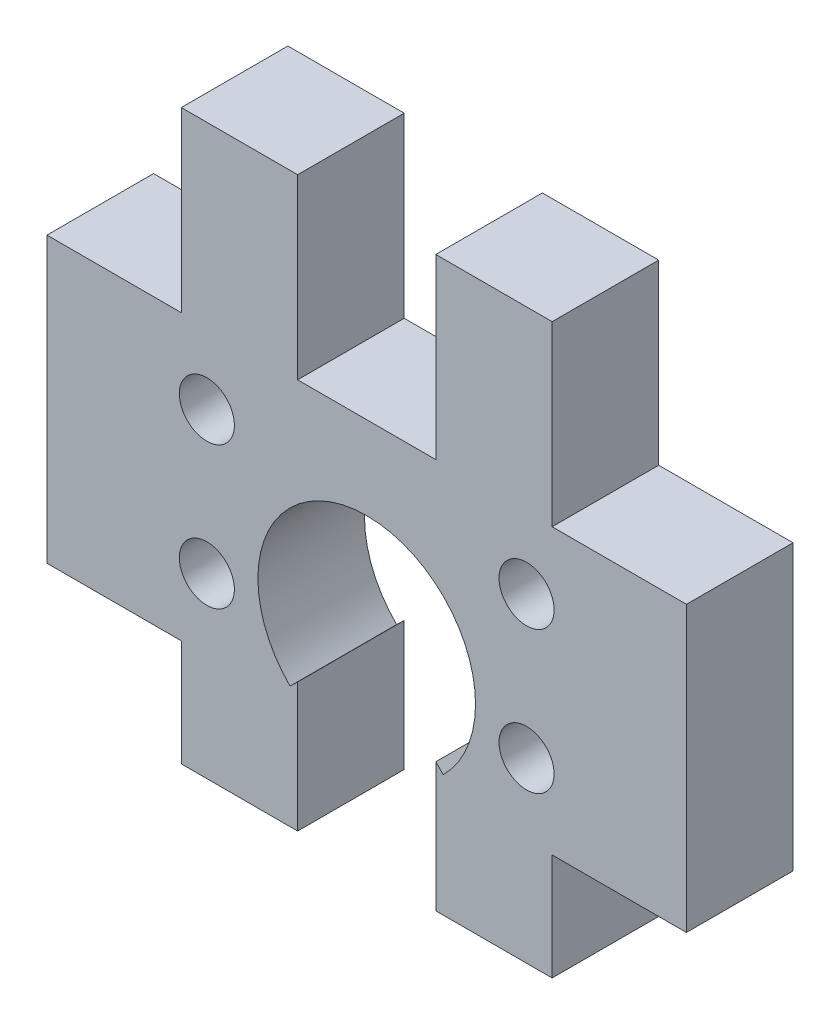
ISO-10303-21;
HEADER;
FILE_DESCRIPTION(('STEP AP214'),'2;1');
FILE_NAME('part.step','',(''),(''),'','','');
FILE_SCHEMA(('AUTOMOTIVE_DESIGN { 1 0 10303 214 1 1 1 1 }'));
ENDSEC;
DATA;
#1=APPLICATION_CONTEXT('core data for automotive mechanical design processes');
#2=APPLICATION_PROTOCOL_DEFINITION('international standard','automotive_design',2000,#1);
#3=PRODUCT_CONTEXT('',#1,'mechanical');
#4=PRODUCT('Part','Part','',(#3));
#5=PRODUCT_RELATED_PRODUCT_CATEGORY('part','',(#4));
#6=PRODUCT_DEFINITION_FORMATION('','',#4);
#7=PRODUCT_DEFINITION_CONTEXT('part definition',#1,'design');
#8=PRODUCT_DEFINITION('design','',#6,#7);
#9=PRODUCT_DEFINITION_SHAPE('','',#8);
#10=(LENGTH_UNIT() NAMED_UNIT(*) SI_UNIT(.MILLI.,.METRE.));
#11=(NAMED_UNIT(*) PLANE_ANGLE_UNIT() SI_UNIT($,.RADIAN.));
#12=(NAMED_UNIT(*) SI_UNIT($,.STERADIAN.) SOLID_ANGLE_UNIT());
#13=UNCERTAINTY_MEASURE_WITH_UNIT(LENGTH_MEASURE(1.E-05),#10,'distance_accuracy_value','');
#14=(GEOMETRIC_REPRESENTATION_CONTEXT(3) GLOBAL_UNCERTAINTY_ASSIGNED_CONTEXT((#13)) GLOBAL_UNIT_ASSIGNED_CONTEXT((#10,
#11,#12)) REPRESENTATION_CONTEXT('',''));
#15=CARTESIAN_POINT('',(0.,0.,0.));
#16=DIRECTION('',(0.,0.,1.));
#17=DIRECTION('',(1.,0.,0.));
#18=AXIS2_PLACEMENT_3D('',#15,#16,#17);
#19=CARTESIAN_POINT('',(49.6145376154278,-22.,-64.0000000008047));
#20=DIRECTION('',(-1.,0.,0.));
#21=DIRECTION('',(0.,0.,1.));
#22=AXIS2_PLACEMENT_3D('',#19,#20,#21);
#23=PLANE('',#22);
#24=DIRECTION('',(0.,1.,0.));
#25=VECTOR('',#24,1.);
#26=CARTESIAN_POINT('',(49.6145376154278,-22.,-70.0000000008047));
#27=LINE('',#26,#25);
#28=CARTESIAN_POINT('',(49.6145376154278,-22.,-70.0000000008047));
#29=VERTEX_POINT('',#28);
#30=CARTESIAN_POINT('',(49.6145376154278,-14.7305411481388,-70.0000000008047));
#31=VERTEX_POINT('',#30);
#32=EDGE_CURVE('E321',#29,#31,#27,.T.);
#33=ORIENTED_EDGE('',*,*,#32,.T.);
#34=DIRECTION('',(0.,0.,-1.));
#35=VECTOR('',#34,1.);
#36=CARTESIAN_POINT('',(49.6145376154278,-14.7305411481388,-64.0000000008047));
#37=LINE('',#36,#35);
#38=CARTESIAN_POINT('',(49.6145376154278,-14.7305411481388,-64.0000000008047));
#39=VERTEX_POINT('',#38);
#40=EDGE_CURVE('E333',#39,#31,#37,.T.);
#41=ORIENTED_EDGE('',*,*,#40,.F.);
#42=DIRECTION('',(0.,1.,0.));
#43=VECTOR('',#42,1.);
#44=CARTESIAN_POINT('',(49.6145376154278,-22.,-64.0000000008047));
#45=LINE('',#44,#43);
#46=CARTESIAN_POINT('',(49.6145376154278,-22.,-64.0000000008047));
#47=VERTEX_POINT('',#46);
#48=EDGE_CURVE('E11',#47,#39,#45,.T.);
#49=ORIENTED_EDGE('',*,*,#48,.F.);
#50=DIRECTION('',(0.,0.,1.));
#51=VECTOR('',#50,1.);
#52=CARTESIAN_POINT('',(49.6145376154278,-22.,-64.0000000008047));
#53=LINE('',#52,#51);
#54=EDGE_CURVE('E315',#29,#47,#53,.T.);
#55=ORIENTED_EDGE('',*,*,#54,.F.);
#56=EDGE_LOOP('',(#33,#41,#49,#55));
#57=FACE_BOUND('',#56,.T.);
#58=ADVANCED_FACE('F36',(#57),#23,.F.);
#59=CARTESIAN_POINT('',(49.6145376154278,-22.,-64.0000000008047));
#60=DIRECTION('',(0.,0.,-1.));
#61=DIRECTION('',(-1.,0.,0.));
#62=AXIS2_PLACEMENT_3D('',#59,#60,#61);
#63=PLANE('',#62);
#64=ORIENTED_EDGE('',*,*,#48,.T.);
#65=DIRECTION('',(0.717506685731035,0.696551617564172,0.));
#66=VECTOR('',#65,1.);
#67=CARTESIAN_POINT('',(49.6145376154278,-14.7305411481388,-64.0000000008047));
#68=LINE('',#67,#66);
#69=CARTESIAN_POINT('',(49.1867802462308,-15.1458056932149,-64.0000000008047));
#70=VERTEX_POINT('',#69);
#71=EDGE_CURVE('E339',#70,#39,#68,.T.);
#72=ORIENTED_EDGE('',*,*,#71,.F.);
#73=CARTESIAN_POINT('',(53.5029820344726,-10.8,-64.0000000008047));
#74=DIRECTION('',(0.,0.,1.));
#75=DIRECTION('',(-1.,0.,0.));
#76=AXIS2_PLACEMENT_3D('',#73,#74,#75);
#77=CIRCLE('',#76,6.125);
#78=CARTESIAN_POINT('',(57.8128248740396,-15.1521120962393,-64.0000000008047));
#79=VERTEX_POINT('',#78);
#80=EDGE_CURVE('E344',#79,#70,#77,.T.);
#81=ORIENTED_EDGE('',*,*,#80,.F.);
#82=DIRECTION('',(0.706962045319872,-0.707251487433673,0.));
#83=VECTOR('',#82,1.);
#84=CARTESIAN_POINT('',(57.3914264535173,-14.7305411481388,-64.0000000008047));
#85=LINE('',#84,#83);
#86=CARTESIAN_POINT('',(57.3914264535173,-14.7305411481388,-64.0000000008047));
#87=VERTEX_POINT('',#86);
#88=EDGE_CURVE('E346',#87,#79,#85,.T.);
#89=ORIENTED_EDGE('',*,*,#88,.F.);
#90=DIRECTION('',(0.,1.,0.));
#91=VECTOR('',#90,1.);
#92=CARTESIAN_POINT('',(57.3914264535173,-16.,-64.0000000008047));
#93=LINE('',#92,#91);
#94=CARTESIAN_POINT('',(57.3914264535173,-22.,-64.0000000008047));
#95=VERTEX_POINT('',#94);
#96=EDGE_CURVE('E361',#95,#87,#93,.T.);
#97=ORIENTED_EDGE('',*,*,#96,.F.);
#98=DIRECTION('',(-1.,0.,0.));
#99=VECTOR('',#98,1.);
#100=CARTESIAN_POINT('',(57.3914264535173,-22.,-64.0000000008047));
#101=LINE('',#100,#99);
#102=CARTESIAN_POINT('',(63.9414264535173,-22.,-64.0000000008047));
#103=VERTEX_POINT('',#102);
#104=EDGE_CURVE('E735',#103,#95,#101,.T.);
#105=ORIENTED_EDGE('',*,*,#104,.F.);
#106=DIRECTION('',(0.,1.,0.));
#107=VECTOR('',#106,1.);
#108=CARTESIAN_POINT('',(63.9414264535173,-22.,-64.0000000008047));
#109=LINE('',#108,#107);
#110=CARTESIAN_POINT('',(63.9414264535173,-16.,-64.0000000008047));
#111=VERTEX_POINT('',#110);
#112=EDGE_CURVE('E741',#103,#111,#109,.T.);
#113=ORIENTED_EDGE('',*,*,#112,.T.);
#114=DIRECTION('',(1.,0.,0.));
#115=VECTOR('',#114,1.);
#116=CARTESIAN_POINT('',(71.5029820344726,-16.,-64.0000000008047));
#117=LINE('',#116,#115);
#118=CARTESIAN_POINT('',(71.5029820344726,-16.,-64.0000000008047));
#119=VERTEX_POINT('',#118);
#120=EDGE_CURVE('E293',#111,#119,#117,.T.);
#121=ORIENTED_EDGE('',*,*,#120,.T.);
#122=DIRECTION('',(0.,1.,0.));
#123=VECTOR('',#122,1.);
#124=CARTESIAN_POINT('',(71.5029820344726,0.,-64.0000000008047));
#125=LINE('',#124,#123);
#126=CARTESIAN_POINT('',(71.5029820344726,0.,-64.0000000008047));
#127=VERTEX_POINT('',#126);
#128=EDGE_CURVE('E264',#119,#127,#125,.T.);
#129=ORIENTED_EDGE('',*,*,#128,.T.);
#130=DIRECTION('',(-1.,0.,0.));
#131=VECTOR('',#130,1.);
#132=CARTESIAN_POINT('',(71.5029820344726,0.,-64.0000000008047));
#133=LINE('',#132,#131);
#134=CARTESIAN_POINT('',(63.9414264535173,0.,-64.0000000008047));
#135=VERTEX_POINT('',#134);
#136=EDGE_CURVE('E276',#127,#135,#133,.T.);
#137=ORIENTED_EDGE('',*,*,#136,.T.);
#138=DIRECTION('',(0.,-1.,0.));
#139=VECTOR('',#138,1.);
#140=CARTESIAN_POINT('',(63.9414264535173,10.,-64.0000000008047));
#141=LINE('',#140,#139);
#142=CARTESIAN_POINT('',(63.9414264535173,10.,-64.0000000008047));
#143=VERTEX_POINT('',#142);
#144=EDGE_CURVE('E241',#143,#135,#141,.T.);
#145=ORIENTED_EDGE('',*,*,#144,.F.);
#146=DIRECTION('',(1.,0.,0.));
#147=VECTOR('',#146,1.);
#148=CARTESIAN_POINT('',(63.9414264535173,10.,-64.0000000008047));
#149=LINE('',#148,#147);
#150=CARTESIAN_POINT('',(57.3914264535173,10.,-64.0000000008047));
#151=VERTEX_POINT('',#150);
#152=EDGE_CURVE('E219',#151,#143,#149,.T.);
#153=ORIENTED_EDGE('',*,*,#152,.F.);
#154=DIRECTION('',(0.,-1.,0.));
#155=VECTOR('',#154,1.);
#156=CARTESIAN_POINT('',(57.3914264535173,10.,-64.0000000008047));
#157=LINE('',#156,#155);
#158=CARTESIAN_POINT('',(57.3914264535173,0.,-64.0000000008047));
#159=VERTEX_POINT('',#158);
#160=EDGE_CURVE('E228',#151,#159,#157,.T.);
#161=ORIENTED_EDGE('',*,*,#160,.T.);
#162=CARTESIAN_POINT('',(49.6145376154278,0.,-64.0000000008047));
#163=VERTEX_POINT('',#162);
#164=EDGE_CURVE('E263',#159,#163,#133,.T.);
#165=ORIENTED_EDGE('',*,*,#164,.T.);
#166=DIRECTION('',(0.,-1.,0.));
#167=VECTOR('',#166,1.);
#168=CARTESIAN_POINT('',(49.6145376154278,10.,-64.0000000008047));
#169=LINE('',#168,#167);
#170=CARTESIAN_POINT('',(49.6145376154278,10.,-64.0000000008047));
#171=VERTEX_POINT('',#170);
#172=EDGE_CURVE('E215',#171,#163,#169,.T.);
#173=ORIENTED_EDGE('',*,*,#172,.F.);
#174=DIRECTION('',(1.,0.,0.));
#175=VECTOR('',#174,1.);
#176=CARTESIAN_POINT('',(49.6145376154278,10.,-64.0000000008047));
#177=LINE('',#176,#175);
#178=CARTESIAN_POINT('',(43.0645376154278,10.,-64.0000000008047));
#179=VERTEX_POINT('',#178);
#180=EDGE_CURVE('E192',#179,#171,#177,.T.);
#181=ORIENTED_EDGE('',*,*,#180,.F.);
#182=DIRECTION('',(0.,-1.,0.));
#183=VECTOR('',#182,1.);
#184=CARTESIAN_POINT('',(43.0645376154278,10.,-64.0000000008047));
#185=LINE('',#184,#183);
#186=CARTESIAN_POINT('',(43.0645376154278,0.,-64.0000000008047));
#187=VERTEX_POINT('',#186);
#188=EDGE_CURVE('E189',#179,#187,#185,.T.);
#189=ORIENTED_EDGE('',*,*,#188,.T.);
#190=CARTESIAN_POINT('',(35.5029820344726,0.,-64.0000000008047));
#191=VERTEX_POINT('',#190);
#192=EDGE_CURVE('E260',#187,#191,#133,.T.);
#193=ORIENTED_EDGE('',*,*,#192,.T.);
#194=DIRECTION('',(0.,-1.,0.));
#195=VECTOR('',#194,1.);
#196=CARTESIAN_POINT('',(35.5029820344726,0.,-64.0000000008047));
#197=LINE('',#196,#195);
#198=CARTESIAN_POINT('',(35.5029820344726,-16.,-64.0000000008047));
#199=VERTEX_POINT('',#198);
#200=EDGE_CURVE('E270',#191,#199,#197,.T.);
#201=ORIENTED_EDGE('',*,*,#200,.T.);
#202=CARTESIAN_POINT('',(43.0645376154278,-16.,-64.0000000008047));
#203=VERTEX_POINT('',#202);
#204=EDGE_CURVE('E290',#199,#203,#117,.T.);
#205=ORIENTED_EDGE('',*,*,#204,.T.);
#206=DIRECTION('',(0.,1.,0.));
#207=VECTOR('',#206,1.);
#208=CARTESIAN_POINT('',(43.0645376154278,-22.,-64.0000000008047));
#209=LINE('',#208,#207);
#210=CARTESIAN_POINT('',(43.0645376154278,-22.,-64.0000000008047));
#211=VERTEX_POINT('',#210);
#212=EDGE_CURVE('E43',#211,#203,#209,.T.);
#213=ORIENTED_EDGE('',*,*,#212,.F.);
#214=DIRECTION('',(-1.,0.,0.));
#215=VECTOR('',#214,1.);
#216=CARTESIAN_POINT('',(49.6145376154278,-22.,-64.0000000008047));
#217=LINE('',#216,#215);
#218=EDGE_CURVE('E317',#47,#211,#217,.T.);
#219=ORIENTED_EDGE('',*,*,#218,.F.);
#220=EDGE_LOOP('',(#64,#72,#81,#89,#97,#105,#113,#121,#129,#137,#145,#153,#161,#165,#173,#181,
#189,#193,#201,#205,#213,#219));
#221=FACE_BOUND('',#220,.T.);
#222=CARTESIAN_POINT('',(62.5029820344725,-12.,-64.0000000008047));
#223=DIRECTION('',(0.,0.,-1.));
#224=DIRECTION('',(-1.,0.,0.));
#225=AXIS2_PLACEMENT_3D('',#222,#223,#224);
#226=CIRCLE('',#225,1.54999999999999);
#227=CARTESIAN_POINT('',(60.9529820344726,-12.,-64.0000000008047));
#228=VERTEX_POINT('',#227);
#229=EDGE_CURVE('E747',#228,#228,#226,.T.);
#230=ORIENTED_EDGE('',*,*,#229,.T.);
#231=EDGE_LOOP('',(#230));
#232=FACE_BOUND('',#231,.T.);
#233=CARTESIAN_POINT('',(44.5029820344726,-12.,-64.0000000008047));
#234=DIRECTION('',(0.,0.,-1.));
#235=DIRECTION('',(-1.,0.,0.));
#236=AXIS2_PLACEMENT_3D('',#233,#234,#235);
#237=CIRCLE('',#236,1.55);
#238=CARTESIAN_POINT('',(42.9529820344725,-12.,-64.0000000008047));
#239=VERTEX_POINT('',#238);
#240=EDGE_CURVE('E753',#239,#239,#237,.T.);
#241=ORIENTED_EDGE('',*,*,#240,.T.);
#242=EDGE_LOOP('',(#241));
#243=FACE_BOUND('',#242,.T.);
#244=CARTESIAN_POINT('',(44.5029820344726,-4.,-64.0000000008047));
#245=DIRECTION('',(0.,0.,-1.));
#246=DIRECTION('',(-1.,0.,0.));
#247=AXIS2_PLACEMENT_3D('',#244,#245,#246);
#248=CIRCLE('',#247,1.55);
#249=CARTESIAN_POINT('',(42.9529820344725,-4.,-64.0000000008047));
#250=VERTEX_POINT('',#249);
#251=EDGE_CURVE('E759',#250,#250,#248,.T.);
#252=ORIENTED_EDGE('',*,*,#251,.T.);
#253=EDGE_LOOP('',(#252));
#254=FACE_BOUND('',#253,.T.);
#255=CARTESIAN_POINT('',(62.5029820344725,-4.,-64.0000000008047));
#256=DIRECTION('',(0.,0.,-1.));
#257=DIRECTION('',(-1.,0.,0.));
#258=AXIS2_PLACEMENT_3D('',#255,#256,#257);
#259=CIRCLE('',#258,1.54999999999999);
#260=CARTESIAN_POINT('',(60.9529820344726,-4.,-64.0000000008047));
#261=VERTEX_POINT('',#260);
#262=EDGE_CURVE('E354',#261,#261,#259,.T.);
#263=ORIENTED_EDGE('',*,*,#262,.T.);
#264=EDGE_LOOP('',(#263));
#265=FACE_BOUND('',#264,.T.);
#266=ADVANCED_FACE('F304',(#221,#232,#243,#254,#265),#63,.F.);
#267=CARTESIAN_POINT('',(43.0645376154278,-22.,-64.0000000008047));
#268=DIRECTION('',(1.,0.,0.));
#269=DIRECTION('',(0.,0.,-1.));
#270=AXIS2_PLACEMENT_3D('',#267,#268,#269);
#271=PLANE('',#270);
#272=DIRECTION('',(0.,0.,-1.));
#273=VECTOR('',#272,1.);
#274=CARTESIAN_POINT('',(43.0645376154278,-16.,-64.0000000008047));
#275=LINE('',#274,#273);
#276=CARTESIAN_POINT('',(43.0645376154278,-16.,-70.0000000008047));
#277=VERTEX_POINT('',#276);
#278=EDGE_CURVE('E289',#203,#277,#275,.T.);
#279=ORIENTED_EDGE('',*,*,#278,.T.);
#280=DIRECTION('',(0.,1.,0.));
#281=VECTOR('',#280,1.);
#282=CARTESIAN_POINT('',(43.0645376154278,-22.,-70.0000000008047));
#283=LINE('',#282,#281);
#284=CARTESIAN_POINT('',(43.0645376154278,-22.,-70.0000000008047));
#285=VERTEX_POINT('',#284);
#286=EDGE_CURVE('E323',#285,#277,#283,.T.);
#287=ORIENTED_EDGE('',*,*,#286,.F.);
#288=DIRECTION('',(0.,0.,-1.));
#289=VECTOR('',#288,1.);
#290=CARTESIAN_POINT('',(43.0645376154278,-22.,-64.0000000008047));
#291=LINE('',#290,#289);
#292=EDGE_CURVE('E55',#211,#285,#291,.T.);
#293=ORIENTED_EDGE('',*,*,#292,.F.);
#294=ORIENTED_EDGE('',*,*,#212,.T.);
#295=EDGE_LOOP('',(#279,#287,#293,#294));
#296=FACE_BOUND('',#295,.T.);
#297=ADVANCED_FACE('F324',(#296),#271,.F.);
#298=CARTESIAN_POINT('',(49.6145376154278,-22.,-70.0000000008047));
#299=DIRECTION('',(0.,0.,1.));
#300=DIRECTION('',(1.,0.,0.));
#301=AXIS2_PLACEMENT_3D('',#298,#299,#300);
#302=PLANE('',#301);
#303=ORIENTED_EDGE('',*,*,#286,.T.);
#304=DIRECTION('',(1.,0.,0.));
#305=VECTOR('',#304,1.);
#306=CARTESIAN_POINT('',(71.5029820344726,-16.,-70.0000000008047));
#307=LINE('',#306,#305);
#308=CARTESIAN_POINT('',(35.5029820344726,-16.,-70.0000000008047));
#309=VERTEX_POINT('',#308);
#310=EDGE_CURVE('E282',#309,#277,#307,.T.);
#311=ORIENTED_EDGE('',*,*,#310,.F.);
#312=DIRECTION('',(0.,-1.,0.));
#313=VECTOR('',#312,1.);
#314=CARTESIAN_POINT('',(35.5029820344726,0.,-70.0000000008047));
#315=LINE('',#314,#313);
#316=CARTESIAN_POINT('',(35.5029820344726,0.,-70.0000000008047));
#317=VERTEX_POINT('',#316);
#318=EDGE_CURVE('E370',#317,#309,#315,.T.);
#319=ORIENTED_EDGE('',*,*,#318,.F.);
#320=DIRECTION('',(-1.,0.,0.));
#321=VECTOR('',#320,1.);
#322=CARTESIAN_POINT('',(71.5029820344726,0.,-70.0000000008047));
#323=LINE('',#322,#321);
#324=CARTESIAN_POINT('',(43.0645376154278,0.,-70.0000000008047));
#325=VERTEX_POINT('',#324);
#326=EDGE_CURVE('E209',#325,#317,#323,.T.);
#327=ORIENTED_EDGE('',*,*,#326,.F.);
#328=DIRECTION('',(0.,-1.,0.));
#329=VECTOR('',#328,1.);
#330=CARTESIAN_POINT('',(43.0645376154278,10.,-70.0000000008047));
#331=LINE('',#330,#329);
#332=CARTESIAN_POINT('',(43.0645376154278,10.,-70.0000000008047));
#333=VERTEX_POINT('',#332);
#334=EDGE_CURVE('E187',#333,#325,#331,.T.);
#335=ORIENTED_EDGE('',*,*,#334,.F.);
#336=DIRECTION('',(-1.,0.,0.));
#337=VECTOR('',#336,1.);
#338=CARTESIAN_POINT('',(43.0645376154278,10.,-70.0000000008047));
#339=LINE('',#338,#337);
#340=CARTESIAN_POINT('',(49.6145376154278,10.,-70.0000000008047));
#341=VERTEX_POINT('',#340);
#342=EDGE_CURVE('E193',#341,#333,#339,.T.);
#343=ORIENTED_EDGE('',*,*,#342,.F.);
#344=DIRECTION('',(0.,-1.,0.));
#345=VECTOR('',#344,1.);
#346=CARTESIAN_POINT('',(49.6145376154278,10.,-70.0000000008047));
#347=LINE('',#346,#345);
#348=CARTESIAN_POINT('',(49.6145376154278,0.,-70.0000000008047));
#349=VERTEX_POINT('',#348);
#350=EDGE_CURVE('E413',#341,#349,#347,.T.);
#351=ORIENTED_EDGE('',*,*,#350,.T.);
#352=CARTESIAN_POINT('',(57.3914264535173,0.,-70.0000000008047));
#353=VERTEX_POINT('',#352);
#354=EDGE_CURVE('E235',#353,#349,#323,.T.);
#355=ORIENTED_EDGE('',*,*,#354,.F.);
#356=DIRECTION('',(0.,-1.,0.));
#357=VECTOR('',#356,1.);
#358=CARTESIAN_POINT('',(57.3914264535173,10.,-70.0000000008047));
#359=LINE('',#358,#357);
#360=CARTESIAN_POINT('',(57.3914264535173,10.,-70.0000000008047));
#361=VERTEX_POINT('',#360);
#362=EDGE_CURVE('E242',#361,#353,#359,.T.);
#363=ORIENTED_EDGE('',*,*,#362,.F.);
#364=DIRECTION('',(-1.,0.,0.));
#365=VECTOR('',#364,1.);
#366=CARTESIAN_POINT('',(57.3914264535173,10.,-70.0000000008047));
#367=LINE('',#366,#365);
#368=CARTESIAN_POINT('',(63.9414264535173,10.,-70.0000000008047));
#369=VERTEX_POINT('',#368);
#370=EDGE_CURVE('E224',#369,#361,#367,.T.);
#371=ORIENTED_EDGE('',*,*,#370,.F.);
#372=DIRECTION('',(0.,-1.,0.));
#373=VECTOR('',#372,1.);
#374=CARTESIAN_POINT('',(63.9414264535173,10.,-70.0000000008047));
#375=LINE('',#374,#373);
#376=CARTESIAN_POINT('',(63.9414264535173,0.,-70.0000000008047));
#377=VERTEX_POINT('',#376);
#378=EDGE_CURVE('E238',#369,#377,#375,.T.);
#379=ORIENTED_EDGE('',*,*,#378,.T.);
#380=CARTESIAN_POINT('',(71.5029820344726,0.,-70.0000000008047));
#381=VERTEX_POINT('',#380);
#382=EDGE_CURVE('E373',#381,#377,#323,.T.);
#383=ORIENTED_EDGE('',*,*,#382,.F.);
#384=DIRECTION('',(0.,1.,0.));
#385=VECTOR('',#384,1.);
#386=CARTESIAN_POINT('',(71.5029820344726,0.,-70.0000000008047));
#387=LINE('',#386,#385);
#388=CARTESIAN_POINT('',(71.5029820344726,-16.,-70.0000000008047));
#389=VERTEX_POINT('',#388);
#390=EDGE_CURVE('E292',#389,#381,#387,.T.);
#391=ORIENTED_EDGE('',*,*,#390,.F.);
#392=CARTESIAN_POINT('',(63.9414264535173,-16.,-70.0000000008047));
#393=VERTEX_POINT('',#392);
#394=EDGE_CURVE('E376',#393,#389,#307,.T.);
#395=ORIENTED_EDGE('',*,*,#394,.F.);
#396=DIRECTION('',(0.,1.,0.));
#397=VECTOR('',#396,1.);
#398=CARTESIAN_POINT('',(63.9414264535173,-22.,-70.0000000008047));
#399=LINE('',#398,#397);
#400=CARTESIAN_POINT('',(63.9414264535173,-22.,-70.0000000008047));
#401=VERTEX_POINT('',#400);
#402=EDGE_CURVE('E744',#401,#393,#399,.T.);
#403=ORIENTED_EDGE('',*,*,#402,.F.);
#404=DIRECTION('',(1.,0.,0.));
#405=VECTOR('',#404,1.);
#406=CARTESIAN_POINT('',(57.3914264535173,-22.,-70.0000000008047));
#407=LINE('',#406,#405);
#408=CARTESIAN_POINT('',(57.3914264535173,-22.,-70.0000000008047));
#409=VERTEX_POINT('',#408);
#410=EDGE_CURVE('E733',#409,#401,#407,.T.);
#411=ORIENTED_EDGE('',*,*,#410,.F.);
#412=DIRECTION('',(0.,1.,0.));
#413=VECTOR('',#412,1.);
#414=CARTESIAN_POINT('',(57.3914264535173,-16.,-70.0000000008047));
#415=LINE('',#414,#413);
#416=CARTESIAN_POINT('',(57.3914264535173,-14.7305411481388,-70.0000000008047));
#417=VERTEX_POINT('',#416);
#418=EDGE_CURVE('E350',#409,#417,#415,.T.);
#419=ORIENTED_EDGE('',*,*,#418,.T.);
#420=DIRECTION('',(0.706962045319872,-0.707251487433673,0.));
#421=VECTOR('',#420,1.);
#422=CARTESIAN_POINT('',(57.3914264535173,-14.7305411481388,-70.0000000008047));
#423=LINE('',#422,#421);
#424=CARTESIAN_POINT('',(57.8128248740396,-15.1521120962393,-70.0000000008047));
#425=VERTEX_POINT('',#424);
#426=EDGE_CURVE('E353',#417,#425,#423,.T.);
#427=ORIENTED_EDGE('',*,*,#426,.T.);
#428=CARTESIAN_POINT('',(53.5029820344726,-10.8,-70.0000000008047));
#429=DIRECTION('',(0.,0.,1.));
#430=DIRECTION('',(1.,0.,0.));
#431=AXIS2_PLACEMENT_3D('',#428,#429,#430);
#432=CIRCLE('',#431,6.125);
#433=CARTESIAN_POINT('',(49.1867802462308,-15.1458056932149,-70.0000000008047));
#434=VERTEX_POINT('',#433);
#435=EDGE_CURVE('E357',#425,#434,#432,.T.);
#436=ORIENTED_EDGE('',*,*,#435,.T.);
#437=DIRECTION('',(0.717506685731035,0.696551617564172,0.));
#438=VECTOR('',#437,1.);
#439=CARTESIAN_POINT('',(49.6145376154278,-14.7305411481388,-70.0000000008047));
#440=LINE('',#439,#438);
#441=EDGE_CURVE('E360',#434,#31,#440,.T.);
#442=ORIENTED_EDGE('',*,*,#441,.T.);
#443=ORIENTED_EDGE('',*,*,#32,.F.);
#444=DIRECTION('',(1.,0.,0.));
#445=VECTOR('',#444,1.);
#446=CARTESIAN_POINT('',(49.6145376154278,-22.,-70.0000000008047));
#447=LINE('',#446,#445);
#448=EDGE_CURVE('E50',#285,#29,#447,.T.);
#449=ORIENTED_EDGE('',*,*,#448,.F.);
#450=EDGE_LOOP('',(#303,#311,#319,#327,#335,#343,#351,#355,#363,#371,#379,#383,#391,#395,#403,
#411,#419,#427,#436,#442,#443,#449));
#451=FACE_BOUND('',#450,.T.);
#452=CARTESIAN_POINT('',(62.5029820344725,-12.,-70.0000000008047));
#453=DIRECTION('',(0.,0.,-1.));
#454=DIRECTION('',(-1.,0.,0.));
#455=AXIS2_PLACEMENT_3D('',#452,#453,#454);
#456=CIRCLE('',#455,1.54999999999999);
#457=CARTESIAN_POINT('',(60.9529820344726,-12.,-70.0000000008047));
#458=VERTEX_POINT('',#457);
#459=EDGE_CURVE('E746',#458,#458,#456,.T.);
#460=ORIENTED_EDGE('',*,*,#459,.F.);
#461=EDGE_LOOP('',(#460));
#462=FACE_BOUND('',#461,.T.);
#463=CARTESIAN_POINT('',(44.5029820344726,-12.,-70.0000000008047));
#464=DIRECTION('',(0.,0.,-1.));
#465=DIRECTION('',(-1.,0.,0.));
#466=AXIS2_PLACEMENT_3D('',#463,#464,#465);
#467=CIRCLE('',#466,1.55);
#468=CARTESIAN_POINT('',(42.9529820344725,-12.,-70.0000000008047));
#469=VERTEX_POINT('',#468);
#470=EDGE_CURVE('E750',#469,#469,#467,.T.);
#471=ORIENTED_EDGE('',*,*,#470,.F.);
#472=EDGE_LOOP('',(#471));
#473=FACE_BOUND('',#472,.T.);
#474=CARTESIAN_POINT('',(44.5029820344726,-4.,-70.0000000008047));
#475=DIRECTION('',(0.,0.,-1.));
#476=DIRECTION('',(-1.,0.,0.));
#477=AXIS2_PLACEMENT_3D('',#474,#475,#476);
#478=CIRCLE('',#477,1.55);
#479=CARTESIAN_POINT('',(42.9529820344725,-4.,-70.0000000008047));
#480=VERTEX_POINT('',#479);
#481=EDGE_CURVE('E756',#480,#480,#478,.T.);
#482=ORIENTED_EDGE('',*,*,#481,.F.);
#483=EDGE_LOOP('',(#482));
#484=FACE_BOUND('',#483,.T.);
#485=CARTESIAN_POINT('',(62.5029820344725,-4.,-70.0000000008047));
#486=DIRECTION('',(0.,0.,-1.));
#487=DIRECTION('',(-1.,0.,0.));
#488=AXIS2_PLACEMENT_3D('',#485,#486,#487);
#489=CIRCLE('',#488,1.54999999999999);
#490=CARTESIAN_POINT('',(60.9529820344726,-4.,-70.0000000008047));
#491=VERTEX_POINT('',#490);
#492=EDGE_CURVE('E762',#491,#491,#489,.T.);
#493=ORIENTED_EDGE('',*,*,#492,.F.);
#494=EDGE_LOOP('',(#493));
#495=FACE_BOUND('',#494,.T.);
#496=ADVANCED_FACE('F206',(#451,#462,#473,#484,#495),#302,.F.);
#497=CARTESIAN_POINT('',(0.,-22.,0.));
#498=DIRECTION('',(0.,1.,0.));
#499=DIRECTION('',(0.,0.,1.));
#500=AXIS2_PLACEMENT_3D('',#497,#498,#499);
#501=PLANE('',#500);
#502=ORIENTED_EDGE('',*,*,#54,.T.);
#503=ORIENTED_EDGE('',*,*,#218,.T.);
#504=ORIENTED_EDGE('',*,*,#292,.T.);
#505=ORIENTED_EDGE('',*,*,#448,.T.);
#506=EDGE_LOOP('',(#502,#503,#504,#505));
#507=FACE_BOUND('',#506,.T.);
#508=ADVANCED_FACE('F330',(#507),#501,.F.);
#509=CARTESIAN_POINT('',(71.5029820344726,-16.,-70.0000000008047));
#510=DIRECTION('',(0.,-1.,0.));
#511=DIRECTION('',(0.,0.,-1.));
#512=AXIS2_PLACEMENT_3D('',#509,#510,#511);
#513=PLANE('',#512);
#514=ORIENTED_EDGE('',*,*,#278,.F.);
#515=ORIENTED_EDGE('',*,*,#204,.F.);
#516=DIRECTION('',(0.,0.,1.));
#517=VECTOR('',#516,1.);
#518=CARTESIAN_POINT('',(35.5029820344726,-16.,-70.0000000008047));
#519=LINE('',#518,#517);
#520=EDGE_CURVE('E285',#309,#199,#519,.T.);
#521=ORIENTED_EDGE('',*,*,#520,.F.);
#522=ORIENTED_EDGE('',*,*,#310,.T.);
#523=EDGE_LOOP('',(#514,#515,#521,#522));
#524=FACE_BOUND('',#523,.T.);
#525=ADVANCED_FACE('F310',(#524),#513,.T.);
#526=CARTESIAN_POINT('',(71.5029820344726,0.,-70.0000000008047));
#527=DIRECTION('',(0.,1.,0.));
#528=DIRECTION('',(-1.,0.,0.));
#529=AXIS2_PLACEMENT_3D('',#526,#527,#528);
#530=PLANE('',#529);
#531=ORIENTED_EDGE('',*,*,#192,.F.);
#532=DIRECTION('',(0.,0.,1.));
#533=VECTOR('',#532,1.);
#534=CARTESIAN_POINT('',(43.0645376154278,0.,-64.0000000008047));
#535=LINE('',#534,#533);
#536=EDGE_CURVE('E383',#325,#187,#535,.T.);
#537=ORIENTED_EDGE('',*,*,#536,.F.);
#538=ORIENTED_EDGE('',*,*,#326,.T.);
#539=DIRECTION('',(0.,0.,1.));
#540=VECTOR('',#539,1.);
#541=CARTESIAN_POINT('',(35.5029820344726,0.,-70.0000000008047));
#542=LINE('',#541,#540);
#543=EDGE_CURVE('E281',#317,#191,#542,.T.);
#544=ORIENTED_EDGE('',*,*,#543,.T.);
#545=EDGE_LOOP('',(#531,#537,#538,#544));
#546=FACE_BOUND('',#545,.T.);
#547=ADVANCED_FACE('F382',(#546),#530,.T.);
#548=ORIENTED_EDGE('',*,*,#354,.T.);
#549=DIRECTION('',(0.,0.,-1.));
#550=VECTOR('',#549,1.);
#551=CARTESIAN_POINT('',(49.6145376154278,0.,-70.0000000008047));
#552=LINE('',#551,#550);
#553=EDGE_CURVE('E202',#163,#349,#552,.T.);
#554=ORIENTED_EDGE('',*,*,#553,.F.);
#555=ORIENTED_EDGE('',*,*,#164,.F.);
#556=DIRECTION('',(0.,0.,1.));
#557=VECTOR('',#556,1.);
#558=CARTESIAN_POINT('',(57.3914264535173,0.,-64.0000000008047));
#559=LINE('',#558,#557);
#560=EDGE_CURVE('E213',#353,#159,#559,.T.);
#561=ORIENTED_EDGE('',*,*,#560,.F.);
#562=EDGE_LOOP('',(#548,#554,#555,#561));
#563=FACE_BOUND('',#562,.T.);
#564=ADVANCED_FACE('F412',(#563),#530,.T.);
#565=ORIENTED_EDGE('',*,*,#120,.F.);
#566=DIRECTION('',(0.,0.,1.));
#567=VECTOR('',#566,1.);
#568=CARTESIAN_POINT('',(63.9414264535173,-16.,-64.0000000008047));
#569=LINE('',#568,#567);
#570=EDGE_CURVE('E247',#393,#111,#569,.T.);
#571=ORIENTED_EDGE('',*,*,#570,.F.);
#572=ORIENTED_EDGE('',*,*,#394,.T.);
#573=DIRECTION('',(0.,0.,1.));
#574=VECTOR('',#573,1.);
#575=CARTESIAN_POINT('',(71.5029820344726,-16.,-70.0000000008047));
#576=LINE('',#575,#574);
#577=EDGE_CURVE('E287',#389,#119,#576,.T.);
#578=ORIENTED_EDGE('',*,*,#577,.T.);
#579=EDGE_LOOP('',(#565,#571,#572,#578));
#580=FACE_BOUND('',#579,.T.);
#581=ADVANCED_FACE('F388',(#580),#513,.T.);
#582=CARTESIAN_POINT('',(71.5029820344726,0.,-70.0000000008047));
#583=DIRECTION('',(1.,0.,0.));
#584=DIRECTION('',(0.,0.,-1.));
#585=AXIS2_PLACEMENT_3D('',#582,#583,#584);
#586=PLANE('',#585);
#587=ORIENTED_EDGE('',*,*,#128,.F.);
#588=ORIENTED_EDGE('',*,*,#577,.F.);
#589=ORIENTED_EDGE('',*,*,#390,.T.);
#590=DIRECTION('',(0.,0.,1.));
#591=VECTOR('',#590,1.);
#592=CARTESIAN_POINT('',(71.5029820344726,0.,-70.0000000008047));
#593=LINE('',#592,#591);
#594=EDGE_CURVE('E279',#381,#127,#593,.T.);
#595=ORIENTED_EDGE('',*,*,#594,.T.);
#596=EDGE_LOOP('',(#587,#588,#589,#595));
#597=FACE_BOUND('',#596,.T.);
#598=ADVANCED_FACE('F395',(#597),#586,.T.);
#599=CARTESIAN_POINT('',(35.5029820344726,0.,-70.0000000008047));
#600=DIRECTION('',(-1.,0.,0.));
#601=DIRECTION('',(0.,0.,1.));
#602=AXIS2_PLACEMENT_3D('',#599,#600,#601);
#603=PLANE('',#602);
#604=ORIENTED_EDGE('',*,*,#200,.F.);
#605=ORIENTED_EDGE('',*,*,#543,.F.);
#606=ORIENTED_EDGE('',*,*,#318,.T.);
#607=ORIENTED_EDGE('',*,*,#520,.T.);
#608=EDGE_LOOP('',(#604,#605,#606,#607));
#609=FACE_BOUND('',#608,.T.);
#610=ADVANCED_FACE('F384',(#609),#603,.T.);
#611=DIRECTION('',(0.,0.,-1.));
#612=VECTOR('',#611,1.);
#613=CARTESIAN_POINT('',(63.9414264535173,0.,-70.0000000008047));
#614=LINE('',#613,#612);
#615=EDGE_CURVE('E210',#135,#377,#614,.T.);
#616=ORIENTED_EDGE('',*,*,#615,.F.);
#617=ORIENTED_EDGE('',*,*,#136,.F.);
#618=ORIENTED_EDGE('',*,*,#594,.F.);
#619=ORIENTED_EDGE('',*,*,#382,.T.);
#620=EDGE_LOOP('',(#616,#617,#618,#619));
#621=FACE_BOUND('',#620,.T.);
#622=ADVANCED_FACE('F403',(#621),#530,.T.);
#623=CARTESIAN_POINT('',(57.3914264535173,-16.,-64.0000000008047));
#624=DIRECTION('',(-1.,0.,0.));
#625=DIRECTION('',(0.,0.,1.));
#626=AXIS2_PLACEMENT_3D('',#623,#624,#625);
#627=PLANE('',#626);
#628=ORIENTED_EDGE('',*,*,#418,.F.);
#629=DIRECTION('',(0.,0.,-1.));
#630=VECTOR('',#629,1.);
#631=CARTESIAN_POINT('',(57.3914264535173,-22.,-64.0000000008047));
#632=LINE('',#631,#630);
#633=EDGE_CURVE('E731',#95,#409,#632,.T.);
#634=ORIENTED_EDGE('',*,*,#633,.F.);
#635=ORIENTED_EDGE('',*,*,#96,.T.);
#636=DIRECTION('',(0.,0.,-1.));
#637=VECTOR('',#636,1.);
#638=CARTESIAN_POINT('',(57.3914264535173,-14.7305411481388,-64.0000000008047));
#639=LINE('',#638,#637);
#640=EDGE_CURVE('E367',#87,#417,#639,.T.);
#641=ORIENTED_EDGE('',*,*,#640,.T.);
#642=EDGE_LOOP('',(#628,#634,#635,#641));
#643=FACE_BOUND('',#642,.T.);
#644=ADVANCED_FACE('F447',(#643),#627,.T.);
#645=CARTESIAN_POINT('',(57.3914264535173,-14.7305411481388,-64.0000000008047));
#646=DIRECTION('',(0.707251487433673,0.706962045319872,0.));
#647=DIRECTION('',(-0.706962045319872,0.707251487433673,0.));
#648=AXIS2_PLACEMENT_3D('',#645,#646,#647);
#649=PLANE('',#648);
#650=ORIENTED_EDGE('',*,*,#426,.F.);
#651=ORIENTED_EDGE('',*,*,#640,.F.);
#652=ORIENTED_EDGE('',*,*,#88,.T.);
#653=DIRECTION('',(0.,0.,-1.));
#654=VECTOR('',#653,1.);
#655=CARTESIAN_POINT('',(57.8128248740396,-15.1521120962393,-64.0000000008047));
#656=LINE('',#655,#654);
#657=EDGE_CURVE('E364',#79,#425,#656,.T.);
#658=ORIENTED_EDGE('',*,*,#657,.T.);
#659=EDGE_LOOP('',(#650,#651,#652,#658));
#660=FACE_BOUND('',#659,.T.);
#661=ADVANCED_FACE('F454',(#660),#649,.T.);
#662=CARTESIAN_POINT('',(53.5029820344726,-10.8,-64.0000000008047));
#663=DIRECTION('',(0.,0.,-1.));
#664=DIRECTION('',(-1.,0.,0.));
#665=AXIS2_PLACEMENT_3D('',#662,#663,#664);
#666=CYLINDRICAL_SURFACE('',#665,6.125);
#667=ORIENTED_EDGE('',*,*,#435,.F.);
#668=ORIENTED_EDGE('',*,*,#657,.F.);
#669=ORIENTED_EDGE('',*,*,#80,.T.);
#670=DIRECTION('',(0.,0.,-1.));
#671=VECTOR('',#670,1.);
#672=CARTESIAN_POINT('',(49.1867802462308,-15.1458056932149,-64.0000000008047));
#673=LINE('',#672,#671);
#674=EDGE_CURVE('E338',#70,#434,#673,.T.);
#675=ORIENTED_EDGE('',*,*,#674,.T.);
#676=EDGE_LOOP('',(#667,#668,#669,#675));
#677=FACE_BOUND('',#676,.T.);
#678=ADVANCED_FACE('F458',(#677),#666,.F.);
#679=CARTESIAN_POINT('',(49.6145376154278,-14.7305411481388,-64.0000000008047));
#680=DIRECTION('',(-0.696551617564172,0.717506685731035,0.));
#681=DIRECTION('',(-0.717506685731035,-0.696551617564172,0.));
#682=AXIS2_PLACEMENT_3D('',#679,#680,#681);
#683=PLANE('',#682);
#684=ORIENTED_EDGE('',*,*,#441,.F.);
#685=ORIENTED_EDGE('',*,*,#674,.F.);
#686=ORIENTED_EDGE('',*,*,#71,.T.);
#687=ORIENTED_EDGE('',*,*,#40,.T.);
#688=EDGE_LOOP('',(#684,#685,#686,#687));
#689=FACE_BOUND('',#688,.T.);
#690=ADVANCED_FACE('F342',(#689),#683,.T.);
#691=CARTESIAN_POINT('',(62.5029820344725,-4.,-64.0000000008047));
#692=DIRECTION('',(0.,0.,-1.));
#693=DIRECTION('',(-1.,0.,0.));
#694=AXIS2_PLACEMENT_3D('',#691,#692,#693);
#695=CYLINDRICAL_SURFACE('',#694,1.54999999999999);
#696=ORIENTED_EDGE('',*,*,#262,.F.);
#697=EDGE_LOOP('',(#696));
#698=FACE_BOUND('',#697,.T.);
#699=ORIENTED_EDGE('',*,*,#492,.T.);
#700=EDGE_LOOP('',(#699));
#701=FACE_BOUND('',#700,.T.);
#702=ADVANCED_FACE('F465',(#698,#701),#695,.F.);
#703=CARTESIAN_POINT('',(44.5029820344726,-4.,-64.0000000008047));
#704=DIRECTION('',(0.,0.,-1.));
#705=DIRECTION('',(-1.,0.,0.));
#706=AXIS2_PLACEMENT_3D('',#703,#704,#705);
#707=CYLINDRICAL_SURFACE('',#706,1.55);
#708=ORIENTED_EDGE('',*,*,#251,.F.);
#709=EDGE_LOOP('',(#708));
#710=FACE_BOUND('',#709,.T.);
#711=ORIENTED_EDGE('',*,*,#481,.T.);
#712=EDGE_LOOP('',(#711));
#713=FACE_BOUND('',#712,.T.);
#714=ADVANCED_FACE('F468',(#710,#713),#707,.F.);
#715=CARTESIAN_POINT('',(44.5029820344726,-12.,-64.0000000008047));
#716=DIRECTION('',(0.,0.,-1.));
#717=DIRECTION('',(-1.,0.,0.));
#718=AXIS2_PLACEMENT_3D('',#715,#716,#717);
#719=CYLINDRICAL_SURFACE('',#718,1.55);
#720=ORIENTED_EDGE('',*,*,#240,.F.);
#721=EDGE_LOOP('',(#720));
#722=FACE_BOUND('',#721,.T.);
#723=ORIENTED_EDGE('',*,*,#470,.T.);
#724=EDGE_LOOP('',(#723));
#725=FACE_BOUND('',#724,.T.);
#726=ADVANCED_FACE('F472',(#722,#725),#719,.F.);
#727=CARTESIAN_POINT('',(62.5029820344725,-12.,-64.0000000008047));
#728=DIRECTION('',(0.,0.,-1.));
#729=DIRECTION('',(-1.,0.,0.));
#730=AXIS2_PLACEMENT_3D('',#727,#728,#729);
#731=CYLINDRICAL_SURFACE('',#730,1.54999999999999);
#732=ORIENTED_EDGE('',*,*,#229,.F.);
#733=EDGE_LOOP('',(#732));
#734=FACE_BOUND('',#733,.T.);
#735=ORIENTED_EDGE('',*,*,#459,.T.);
#736=EDGE_LOOP('',(#735));
#737=FACE_BOUND('',#736,.T.);
#738=ADVANCED_FACE('F476',(#734,#737),#731,.F.);
#739=CARTESIAN_POINT('',(63.9414264535173,-22.,-64.0000000008047));
#740=DIRECTION('',(-1.,0.,0.));
#741=DIRECTION('',(0.,0.,1.));
#742=AXIS2_PLACEMENT_3D('',#739,#740,#741);
#743=PLANE('',#742);
#744=ORIENTED_EDGE('',*,*,#570,.T.);
#745=ORIENTED_EDGE('',*,*,#112,.F.);
#746=DIRECTION('',(0.,0.,1.));
#747=VECTOR('',#746,1.);
#748=CARTESIAN_POINT('',(63.9414264535173,-22.,-64.0000000008047));
#749=LINE('',#748,#747);
#750=EDGE_CURVE('E736',#401,#103,#749,.T.);
#751=ORIENTED_EDGE('',*,*,#750,.F.);
#752=ORIENTED_EDGE('',*,*,#402,.T.);
#753=EDGE_LOOP('',(#744,#745,#751,#752));
#754=FACE_BOUND('',#753,.T.);
#755=ADVANCED_FACE('F480',(#754),#743,.F.);
#756=CARTESIAN_POINT('',(0.,-22.,0.));
#757=DIRECTION('',(0.,-1.,0.));
#758=DIRECTION('',(0.,0.,-1.));
#759=AXIS2_PLACEMENT_3D('',#756,#757,#758);
#760=PLANE('',#759);
#761=ORIENTED_EDGE('',*,*,#633,.T.);
#762=ORIENTED_EDGE('',*,*,#410,.T.);
#763=ORIENTED_EDGE('',*,*,#750,.T.);
#764=ORIENTED_EDGE('',*,*,#104,.T.);
#765=EDGE_LOOP('',(#761,#762,#763,#764));
#766=FACE_BOUND('',#765,.T.);
#767=ADVANCED_FACE('F484',(#766),#760,.T.);
#768=CARTESIAN_POINT('',(63.9414264535173,10.,-70.0000000008047));
#769=DIRECTION('',(-1.,0.,0.));
#770=DIRECTION('',(0.,-1.,0.));
#771=AXIS2_PLACEMENT_3D('',#768,#769,#770);
#772=PLANE('',#771);
#773=ORIENTED_EDGE('',*,*,#615,.T.);
#774=ORIENTED_EDGE('',*,*,#378,.F.);
#775=DIRECTION('',(0.,0.,-1.));
#776=VECTOR('',#775,1.);
#777=CARTESIAN_POINT('',(63.9414264535173,10.,-70.0000000008047));
#778=LINE('',#777,#776);
#779=EDGE_CURVE('E222',#143,#369,#778,.T.);
#780=ORIENTED_EDGE('',*,*,#779,.F.);
#781=ORIENTED_EDGE('',*,*,#144,.T.);
#782=EDGE_LOOP('',(#773,#774,#780,#781));
#783=FACE_BOUND('',#782,.T.);
#784=ADVANCED_FACE('F400',(#783),#772,.F.);
#785=CARTESIAN_POINT('',(57.3914264535173,10.,-64.0000000008047));
#786=DIRECTION('',(1.,0.,0.));
#787=DIRECTION('',(0.,1.,0.));
#788=AXIS2_PLACEMENT_3D('',#785,#786,#787);
#789=PLANE('',#788);
#790=ORIENTED_EDGE('',*,*,#560,.T.);
#791=ORIENTED_EDGE('',*,*,#160,.F.);
#792=DIRECTION('',(0.,0.,1.));
#793=VECTOR('',#792,1.);
#794=CARTESIAN_POINT('',(57.3914264535173,10.,-64.0000000008047));
#795=LINE('',#794,#793);
#796=EDGE_CURVE('E226',#361,#151,#795,.T.);
#797=ORIENTED_EDGE('',*,*,#796,.F.);
#798=ORIENTED_EDGE('',*,*,#362,.T.);
#799=EDGE_LOOP('',(#790,#791,#797,#798));
#800=FACE_BOUND('',#799,.T.);
#801=ADVANCED_FACE('F411',(#800),#789,.F.);
#802=CARTESIAN_POINT('',(0.,10.,0.));
#803=DIRECTION('',(0.,-1.,0.));
#804=DIRECTION('',(1.,0.,0.));
#805=AXIS2_PLACEMENT_3D('',#802,#803,#804);
#806=PLANE('',#805);
#807=ORIENTED_EDGE('',*,*,#152,.T.);
#808=ORIENTED_EDGE('',*,*,#779,.T.);
#809=ORIENTED_EDGE('',*,*,#370,.T.);
#810=ORIENTED_EDGE('',*,*,#796,.T.);
#811=EDGE_LOOP('',(#807,#808,#809,#810));
#812=FACE_BOUND('',#811,.T.);
#813=ADVANCED_FACE('F408',(#812),#806,.F.);
#814=CARTESIAN_POINT('',(43.0645376154278,10.,-64.0000000008047));
#815=DIRECTION('',(1.,0.,0.));
#816=DIRECTION('',(0.,1.,0.));
#817=AXIS2_PLACEMENT_3D('',#814,#815,#816);
#818=PLANE('',#817);
#819=ORIENTED_EDGE('',*,*,#536,.T.);
#820=ORIENTED_EDGE('',*,*,#188,.F.);
#821=DIRECTION('',(0.,0.,1.));
#822=VECTOR('',#821,1.);
#823=CARTESIAN_POINT('',(43.0645376154278,10.,-64.0000000008047));
#824=LINE('',#823,#822);
#825=EDGE_CURVE('E182',#333,#179,#824,.T.);
#826=ORIENTED_EDGE('',*,*,#825,.F.);
#827=ORIENTED_EDGE('',*,*,#334,.T.);
#828=EDGE_LOOP('',(#819,#820,#826,#827));
#829=FACE_BOUND('',#828,.T.);
#830=ADVANCED_FACE('F185',(#829),#818,.F.);
#831=CARTESIAN_POINT('',(49.6145376154278,10.,-70.0000000008047));
#832=DIRECTION('',(-1.,0.,0.));
#833=DIRECTION('',(0.,-1.,0.));
#834=AXIS2_PLACEMENT_3D('',#831,#832,#833);
#835=PLANE('',#834);
#836=ORIENTED_EDGE('',*,*,#553,.T.);
#837=ORIENTED_EDGE('',*,*,#350,.F.);
#838=DIRECTION('',(0.,0.,-1.));
#839=VECTOR('',#838,1.);
#840=CARTESIAN_POINT('',(49.6145376154278,10.,-70.0000000008047));
#841=LINE('',#840,#839);
#842=EDGE_CURVE('E198',#171,#341,#841,.T.);
#843=ORIENTED_EDGE('',*,*,#842,.F.);
#844=ORIENTED_EDGE('',*,*,#172,.T.);
#845=EDGE_LOOP('',(#836,#837,#843,#844));
#846=FACE_BOUND('',#845,.T.);
#847=ADVANCED_FACE('F421',(#846),#835,.F.);
#848=CARTESIAN_POINT('',(0.,10.,0.));
#849=DIRECTION('',(0.,-1.,0.));
#850=DIRECTION('',(1.,0.,0.));
#851=AXIS2_PLACEMENT_3D('',#848,#849,#850);
#852=PLANE('',#851);
#853=ORIENTED_EDGE('',*,*,#342,.T.);
#854=ORIENTED_EDGE('',*,*,#825,.T.);
#855=ORIENTED_EDGE('',*,*,#180,.T.);
#856=ORIENTED_EDGE('',*,*,#842,.T.);
#857=EDGE_LOOP('',(#853,#854,#855,#856));
#858=FACE_BOUND('',#857,.T.);
#859=ADVANCED_FACE('F196',(#858),#852,.F.);
#860=CLOSED_SHELL('',(#58,#266,#297,#496,#508,#525,#547,#564,#581,#598,#610,#622,#644,#661,#678,
#690,#702,#714,#726,#738,#755,#767,#784,#801,#813,#830,#847,#859));
#861=MANIFOLD_SOLID_BREP('B2',#860);
#862=ADVANCED_BREP_SHAPE_REPRESENTATION('',(#18,#861),#14);
#863=SHAPE_DEFINITION_REPRESENTATION(#9,#862);
ENDSEC;
END-ISO-10303-21;
